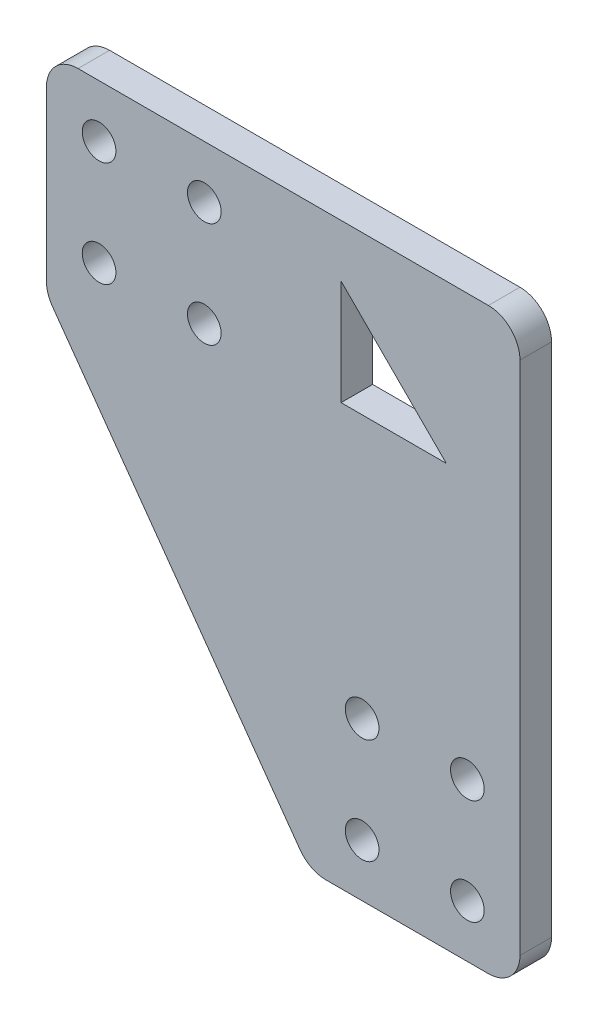
ISO-10303-21;
HEADER;
FILE_DESCRIPTION(('STEP AP214'),'2;1');
FILE_NAME('part.step','',(''),(''),'','','');
FILE_SCHEMA(('AUTOMOTIVE_DESIGN { 1 0 10303 214 1 1 1 1 }'));
ENDSEC;
DATA;
#1=APPLICATION_CONTEXT('core data for automotive mechanical design processes');
#2=APPLICATION_PROTOCOL_DEFINITION('international standard','automotive_design',2000,#1);
#3=PRODUCT_CONTEXT('',#1,'mechanical');
#4=PRODUCT('Part','Part','',(#3));
#5=PRODUCT_RELATED_PRODUCT_CATEGORY('part','',(#4));
#6=PRODUCT_DEFINITION_FORMATION('','',#4);
#7=PRODUCT_DEFINITION_CONTEXT('part definition',#1,'design');
#8=PRODUCT_DEFINITION('design','',#6,#7);
#9=PRODUCT_DEFINITION_SHAPE('','',#8);
#10=(LENGTH_UNIT() NAMED_UNIT(*) SI_UNIT(.MILLI.,.METRE.));
#11=(NAMED_UNIT(*) PLANE_ANGLE_UNIT() SI_UNIT($,.RADIAN.));
#12=(NAMED_UNIT(*) SI_UNIT($,.STERADIAN.) SOLID_ANGLE_UNIT());
#13=UNCERTAINTY_MEASURE_WITH_UNIT(LENGTH_MEASURE(1.E-05),#10,'distance_accuracy_value','');
#14=(GEOMETRIC_REPRESENTATION_CONTEXT(3) GLOBAL_UNCERTAINTY_ASSIGNED_CONTEXT((#13)) GLOBAL_UNIT_ASSIGNED_CONTEXT((#10,
#11,#12)) REPRESENTATION_CONTEXT('',''));
#15=CARTESIAN_POINT('',(0.,0.,0.));
#16=DIRECTION('',(0.,0.,1.));
#17=DIRECTION('',(1.,0.,0.));
#18=AXIS2_PLACEMENT_3D('',#15,#16,#17);
#19=CARTESIAN_POINT('',(0.,0.,3.));
#20=DIRECTION('',(0.,0.,-1.));
#21=DIRECTION('',(-1.,0.,0.));
#22=AXIS2_PLACEMENT_3D('',#19,#20,#21);
#23=PLANE('',#22);
#24=CARTESIAN_POINT('',(30.,-40.,3.));
#25=DIRECTION('',(0.,0.,1.));
#26=DIRECTION('',(-1.,0.,0.));
#27=AXIS2_PLACEMENT_3D('',#24,#25,#26);
#28=CIRCLE('',#27,1.6);
#29=CARTESIAN_POINT('',(28.4,-40.,3.));
#30=VERTEX_POINT('',#29);
#31=EDGE_CURVE('E182',#30,#30,#28,.T.);
#32=ORIENTED_EDGE('',*,*,#31,.F.);
#33=EDGE_LOOP('',(#32));
#34=FACE_BOUND('',#33,.T.);
#35=CARTESIAN_POINT('',(40.,-40.,3.));
#36=DIRECTION('',(0.,0.,1.));
#37=DIRECTION('',(1.,0.,0.));
#38=AXIS2_PLACEMENT_3D('',#35,#36,#37);
#39=CIRCLE('',#38,1.60000000000001);
#40=CARTESIAN_POINT('',(41.6,-40.,3.));
#41=VERTEX_POINT('',#40);
#42=EDGE_CURVE('E190',#41,#41,#39,.T.);
#43=ORIENTED_EDGE('',*,*,#42,.F.);
#44=EDGE_LOOP('',(#43));
#45=FACE_BOUND('',#44,.T.);
#46=CARTESIAN_POINT('',(40.,-50.,3.));
#47=DIRECTION('',(0.,0.,1.));
#48=DIRECTION('',(-1.,0.,0.));
#49=AXIS2_PLACEMENT_3D('',#46,#47,#48);
#50=CIRCLE('',#49,1.60000000000001);
#51=CARTESIAN_POINT('',(38.4,-50.,3.));
#52=VERTEX_POINT('',#51);
#53=EDGE_CURVE('E198',#52,#52,#50,.T.);
#54=ORIENTED_EDGE('',*,*,#53,.F.);
#55=EDGE_LOOP('',(#54));
#56=FACE_BOUND('',#55,.T.);
#57=CARTESIAN_POINT('',(30.,-50.,3.));
#58=DIRECTION('',(0.,0.,1.));
#59=DIRECTION('',(1.,0.,0.));
#60=AXIS2_PLACEMENT_3D('',#57,#58,#59);
#61=CIRCLE('',#60,1.6);
#62=CARTESIAN_POINT('',(31.6,-50.,3.));
#63=VERTEX_POINT('',#62);
#64=EDGE_CURVE('E206',#63,#63,#61,.T.);
#65=ORIENTED_EDGE('',*,*,#64,.F.);
#66=EDGE_LOOP('',(#65));
#67=FACE_BOUND('',#66,.T.);
#68=CARTESIAN_POINT('',(5.,-15.,3.));
#69=DIRECTION('',(0.,0.,1.));
#70=DIRECTION('',(-1.,0.,0.));
#71=AXIS2_PLACEMENT_3D('',#68,#69,#70);
#72=CIRCLE('',#71,1.6);
#73=CARTESIAN_POINT('',(3.4,-15.,3.));
#74=VERTEX_POINT('',#73);
#75=EDGE_CURVE('E214',#74,#74,#72,.T.);
#76=ORIENTED_EDGE('',*,*,#75,.F.);
#77=EDGE_LOOP('',(#76));
#78=FACE_BOUND('',#77,.T.);
#79=CARTESIAN_POINT('',(15.,-15.,3.));
#80=DIRECTION('',(0.,0.,1.));
#81=DIRECTION('',(1.,0.,0.));
#82=AXIS2_PLACEMENT_3D('',#79,#80,#81);
#83=CIRCLE('',#82,1.6);
#84=CARTESIAN_POINT('',(16.6,-15.,3.));
#85=VERTEX_POINT('',#84);
#86=EDGE_CURVE('E222',#85,#85,#83,.T.);
#87=ORIENTED_EDGE('',*,*,#86,.F.);
#88=EDGE_LOOP('',(#87));
#89=FACE_BOUND('',#88,.T.);
#90=CARTESIAN_POINT('',(15.,-5.,3.));
#91=DIRECTION('',(0.,0.,1.));
#92=DIRECTION('',(-1.,0.,0.));
#93=AXIS2_PLACEMENT_3D('',#90,#91,#92);
#94=CIRCLE('',#93,1.6);
#95=CARTESIAN_POINT('',(13.4,-5.,3.));
#96=VERTEX_POINT('',#95);
#97=EDGE_CURVE('E230',#96,#96,#94,.T.);
#98=ORIENTED_EDGE('',*,*,#97,.F.);
#99=EDGE_LOOP('',(#98));
#100=FACE_BOUND('',#99,.T.);
#101=CARTESIAN_POINT('',(5.,-5.,3.));
#102=DIRECTION('',(0.,0.,1.));
#103=DIRECTION('',(1.,0.,0.));
#104=AXIS2_PLACEMENT_3D('',#101,#102,#103);
#105=CIRCLE('',#104,1.6);
#106=CARTESIAN_POINT('',(6.6,-5.,3.));
#107=VERTEX_POINT('',#106);
#108=EDGE_CURVE('E238',#107,#107,#105,.T.);
#109=ORIENTED_EDGE('',*,*,#108,.F.);
#110=EDGE_LOOP('',(#109));
#111=FACE_BOUND('',#110,.T.);
#112=DIRECTION('',(0.581238193719096,-0.813733471206735,0.));
#113=VECTOR('',#112,1.);
#114=CARTESIAN_POINT('',(25.,-55.,3.));
#115=LINE('',#114,#113);
#116=CARTESIAN_POINT('',(0.558799586379798,-20.7823194209317,3.));
#117=VERTEX_POINT('',#116);
#118=CARTESIAN_POINT('',(24.1026532722552,-53.7437145811573,3.));
#119=VERTEX_POINT('',#118);
#120=EDGE_CURVE('E250',#117,#119,#115,.T.);
#121=ORIENTED_EDGE('',*,*,#120,.T.);
#122=CARTESIAN_POINT('',(26.5438536858754,-52.,3.));
#123=DIRECTION('',(0.,0.,-1.));
#124=DIRECTION('',(-1.,0.,0.));
#125=AXIS2_PLACEMENT_3D('',#122,#123,#124);
#126=CIRCLE('',#125,3.);
#127=CARTESIAN_POINT('',(26.5438536858754,-55.,3.));
#128=VERTEX_POINT('',#127);
#129=EDGE_CURVE('E322',#119,#128,#126,.F.);
#130=ORIENTED_EDGE('',*,*,#129,.T.);
#131=DIRECTION('',(1.,0.,0.));
#132=VECTOR('',#131,1.);
#133=CARTESIAN_POINT('',(45.,-55.,3.));
#134=LINE('',#133,#132);
#135=CARTESIAN_POINT('',(42.,-55.,3.));
#136=VERTEX_POINT('',#135);
#137=EDGE_CURVE('E255',#128,#136,#134,.T.);
#138=ORIENTED_EDGE('',*,*,#137,.T.);
#139=CARTESIAN_POINT('',(42.,-52.,3.));
#140=DIRECTION('',(0.,0.,-1.));
#141=DIRECTION('',(-1.,0.,0.));
#142=AXIS2_PLACEMENT_3D('',#139,#140,#141);
#143=CIRCLE('',#142,3.);
#144=CARTESIAN_POINT('',(45.,-52.,3.));
#145=VERTEX_POINT('',#144);
#146=EDGE_CURVE('E319',#136,#145,#143,.F.);
#147=ORIENTED_EDGE('',*,*,#146,.T.);
#148=DIRECTION('',(0.,1.,0.));
#149=VECTOR('',#148,1.);
#150=CARTESIAN_POINT('',(45.,0.,3.));
#151=LINE('',#150,#149);
#152=CARTESIAN_POINT('',(45.,-3.,3.));
#153=VERTEX_POINT('',#152);
#154=EDGE_CURVE('E259',#145,#153,#151,.T.);
#155=ORIENTED_EDGE('',*,*,#154,.T.);
#156=CARTESIAN_POINT('',(42.,-3.,3.));
#157=DIRECTION('',(0.,0.,-1.));
#158=DIRECTION('',(-1.,0.,0.));
#159=AXIS2_PLACEMENT_3D('',#156,#157,#158);
#160=CIRCLE('',#159,3.);
#161=CARTESIAN_POINT('',(42.,0.,3.));
#162=VERTEX_POINT('',#161);
#163=EDGE_CURVE('E66',#153,#162,#160,.F.);
#164=ORIENTED_EDGE('',*,*,#163,.T.);
#165=DIRECTION('',(-1.,0.,0.));
#166=VECTOR('',#165,1.);
#167=CARTESIAN_POINT('',(0.,0.,3.));
#168=LINE('',#167,#166);
#169=CARTESIAN_POINT('',(3.,0.,3.));
#170=VERTEX_POINT('',#169);
#171=EDGE_CURVE('E262',#162,#170,#168,.T.);
#172=ORIENTED_EDGE('',*,*,#171,.T.);
#173=CARTESIAN_POINT('',(3.,-3.,3.));
#174=DIRECTION('',(0.,0.,-1.));
#175=DIRECTION('',(-1.,0.,0.));
#176=AXIS2_PLACEMENT_3D('',#173,#174,#175);
#177=CIRCLE('',#176,3.);
#178=CARTESIAN_POINT('',(0.,-3.,3.));
#179=VERTEX_POINT('',#178);
#180=EDGE_CURVE('E311',#170,#179,#177,.F.);
#181=ORIENTED_EDGE('',*,*,#180,.T.);
#182=DIRECTION('',(0.,-1.,0.));
#183=VECTOR('',#182,1.);
#184=CARTESIAN_POINT('',(0.,-20.,3.));
#185=LINE('',#184,#183);
#186=CARTESIAN_POINT('',(0.,-19.0386048397744,3.));
#187=VERTEX_POINT('',#186);
#188=EDGE_CURVE('E246',#179,#187,#185,.T.);
#189=ORIENTED_EDGE('',*,*,#188,.T.);
#190=CARTESIAN_POINT('',(3.,-19.0386048397744,3.));
#191=DIRECTION('',(0.,0.,-1.));
#192=DIRECTION('',(-1.,0.,0.));
#193=AXIS2_PLACEMENT_3D('',#190,#191,#192);
#194=CIRCLE('',#193,3.);
#195=EDGE_CURVE('E314',#187,#117,#194,.F.);
#196=ORIENTED_EDGE('',*,*,#195,.T.);
#197=EDGE_LOOP('',(#121,#130,#138,#147,#155,#164,#172,#181,#189,#196));
#198=FACE_BOUND('',#197,.T.);
#199=DIRECTION('',(-0.707106781186548,0.707106781186547,0.));
#200=VECTOR('',#199,1.);
#201=CARTESIAN_POINT('',(38.,-15.,3.));
#202=LINE('',#201,#200);
#203=CARTESIAN_POINT('',(38.,-15.,3.));
#204=VERTEX_POINT('',#203);
#205=CARTESIAN_POINT('',(28.,-5.,3.));
#206=VERTEX_POINT('',#205);
#207=EDGE_CURVE('E141',#204,#206,#202,.T.);
#208=ORIENTED_EDGE('',*,*,#207,.F.);
#209=DIRECTION('',(1.,0.,0.));
#210=VECTOR('',#209,1.);
#211=CARTESIAN_POINT('',(28.,-15.,3.));
#212=LINE('',#211,#210);
#213=CARTESIAN_POINT('',(28.,-15.,3.));
#214=VERTEX_POINT('',#213);
#215=EDGE_CURVE('E164',#214,#204,#212,.T.);
#216=ORIENTED_EDGE('',*,*,#215,.F.);
#217=DIRECTION('',(0.,-1.,0.));
#218=VECTOR('',#217,1.);
#219=CARTESIAN_POINT('',(28.,-5.,3.));
#220=LINE('',#219,#218);
#221=EDGE_CURVE('E152',#206,#214,#220,.T.);
#222=ORIENTED_EDGE('',*,*,#221,.F.);
#223=EDGE_LOOP('',(#208,#216,#222));
#224=FACE_BOUND('',#223,.T.);
#225=ADVANCED_FACE('F43',(#34,#45,#56,#67,#78,#89,#100,#111,#198,#224),#23,.F.);
#226=CARTESIAN_POINT('',(0.,0.,0.));
#227=DIRECTION('',(0.,0.,-1.));
#228=DIRECTION('',(-1.,0.,0.));
#229=AXIS2_PLACEMENT_3D('',#226,#227,#228);
#230=PLANE('',#229);
#231=CARTESIAN_POINT('',(40.,-40.,0.));
#232=DIRECTION('',(0.,0.,1.));
#233=DIRECTION('',(1.,0.,0.));
#234=AXIS2_PLACEMENT_3D('',#231,#232,#233);
#235=CIRCLE('',#234,1.60000000000001);
#236=CARTESIAN_POINT('',(41.6,-40.,0.));
#237=VERTEX_POINT('',#236);
#238=EDGE_CURVE('E186',#237,#237,#235,.T.);
#239=ORIENTED_EDGE('',*,*,#238,.T.);
#240=EDGE_LOOP('',(#239));
#241=FACE_BOUND('',#240,.T.);
#242=CARTESIAN_POINT('',(30.,-50.,0.));
#243=DIRECTION('',(0.,0.,1.));
#244=DIRECTION('',(1.,0.,0.));
#245=AXIS2_PLACEMENT_3D('',#242,#243,#244);
#246=CIRCLE('',#245,1.6);
#247=CARTESIAN_POINT('',(31.6,-50.,0.));
#248=VERTEX_POINT('',#247);
#249=EDGE_CURVE('E202',#248,#248,#246,.T.);
#250=ORIENTED_EDGE('',*,*,#249,.T.);
#251=EDGE_LOOP('',(#250));
#252=FACE_BOUND('',#251,.T.);
#253=CARTESIAN_POINT('',(15.,-15.,0.));
#254=DIRECTION('',(0.,0.,1.));
#255=DIRECTION('',(1.,0.,0.));
#256=AXIS2_PLACEMENT_3D('',#253,#254,#255);
#257=CIRCLE('',#256,1.6);
#258=CARTESIAN_POINT('',(16.6,-15.,0.));
#259=VERTEX_POINT('',#258);
#260=EDGE_CURVE('E218',#259,#259,#257,.T.);
#261=ORIENTED_EDGE('',*,*,#260,.T.);
#262=EDGE_LOOP('',(#261));
#263=FACE_BOUND('',#262,.T.);
#264=CARTESIAN_POINT('',(5.,-5.,0.));
#265=DIRECTION('',(0.,0.,1.));
#266=DIRECTION('',(1.,0.,0.));
#267=AXIS2_PLACEMENT_3D('',#264,#265,#266);
#268=CIRCLE('',#267,1.6);
#269=CARTESIAN_POINT('',(6.6,-5.,0.));
#270=VERTEX_POINT('',#269);
#271=EDGE_CURVE('E234',#270,#270,#268,.T.);
#272=ORIENTED_EDGE('',*,*,#271,.T.);
#273=EDGE_LOOP('',(#272));
#274=FACE_BOUND('',#273,.T.);
#275=DIRECTION('',(1.,0.,0.));
#276=VECTOR('',#275,1.);
#277=CARTESIAN_POINT('',(45.,-55.,0.));
#278=LINE('',#277,#276);
#279=CARTESIAN_POINT('',(26.5438536858754,-55.,0.));
#280=VERTEX_POINT('',#279);
#281=CARTESIAN_POINT('',(42.,-55.,0.));
#282=VERTEX_POINT('',#281);
#283=EDGE_CURVE('E273',#280,#282,#278,.T.);
#284=ORIENTED_EDGE('',*,*,#283,.F.);
#285=CARTESIAN_POINT('',(26.5438536858754,-52.,0.));
#286=DIRECTION('',(0.,0.,-1.));
#287=DIRECTION('',(-1.,0.,0.));
#288=AXIS2_PLACEMENT_3D('',#285,#286,#287);
#289=CIRCLE('',#288,3.);
#290=CARTESIAN_POINT('',(24.1026532722552,-53.7437145811573,0.));
#291=VERTEX_POINT('',#290);
#292=EDGE_CURVE('E301',#280,#291,#289,.T.);
#293=ORIENTED_EDGE('',*,*,#292,.T.);
#294=DIRECTION('',(0.581238193719096,-0.813733471206735,0.));
#295=VECTOR('',#294,1.);
#296=CARTESIAN_POINT('',(25.,-55.,0.));
#297=LINE('',#296,#295);
#298=CARTESIAN_POINT('',(0.558799586379798,-20.7823194209317,0.));
#299=VERTEX_POINT('',#298);
#300=EDGE_CURVE('E269',#299,#291,#297,.T.);
#301=ORIENTED_EDGE('',*,*,#300,.F.);
#302=CARTESIAN_POINT('',(3.,-19.0386048397744,0.));
#303=DIRECTION('',(0.,0.,-1.));
#304=DIRECTION('',(-1.,0.,0.));
#305=AXIS2_PLACEMENT_3D('',#302,#303,#304);
#306=CIRCLE('',#305,3.);
#307=CARTESIAN_POINT('',(0.,-19.0386048397744,0.));
#308=VERTEX_POINT('',#307);
#309=EDGE_CURVE('E292',#299,#308,#306,.T.);
#310=ORIENTED_EDGE('',*,*,#309,.T.);
#311=DIRECTION('',(0.,-1.,0.));
#312=VECTOR('',#311,1.);
#313=CARTESIAN_POINT('',(0.,-20.,0.));
#314=LINE('',#313,#312);
#315=CARTESIAN_POINT('',(0.,-3.,0.));
#316=VERTEX_POINT('',#315);
#317=EDGE_CURVE('E242',#316,#308,#314,.T.);
#318=ORIENTED_EDGE('',*,*,#317,.F.);
#319=CARTESIAN_POINT('',(3.,-3.,0.));
#320=DIRECTION('',(0.,0.,-1.));
#321=DIRECTION('',(-1.,0.,0.));
#322=AXIS2_PLACEMENT_3D('',#319,#320,#321);
#323=CIRCLE('',#322,3.);
#324=CARTESIAN_POINT('',(3.,0.,0.));
#325=VERTEX_POINT('',#324);
#326=EDGE_CURVE('E289',#316,#325,#323,.T.);
#327=ORIENTED_EDGE('',*,*,#326,.T.);
#328=DIRECTION('',(-1.,0.,0.));
#329=VECTOR('',#328,1.);
#330=CARTESIAN_POINT('',(0.,0.,0.));
#331=LINE('',#330,#329);
#332=CARTESIAN_POINT('',(42.,0.,0.));
#333=VERTEX_POINT('',#332);
#334=EDGE_CURVE('E251',#333,#325,#331,.T.);
#335=ORIENTED_EDGE('',*,*,#334,.F.);
#336=CARTESIAN_POINT('',(42.,-3.,0.));
#337=DIRECTION('',(0.,0.,-1.));
#338=DIRECTION('',(-1.,0.,0.));
#339=AXIS2_PLACEMENT_3D('',#336,#337,#338);
#340=CIRCLE('',#339,3.);
#341=CARTESIAN_POINT('',(45.,-3.,0.));
#342=VERTEX_POINT('',#341);
#343=EDGE_CURVE('E295',#333,#342,#340,.T.);
#344=ORIENTED_EDGE('',*,*,#343,.T.);
#345=DIRECTION('',(0.,1.,0.));
#346=VECTOR('',#345,1.);
#347=CARTESIAN_POINT('',(45.,0.,0.));
#348=LINE('',#347,#346);
#349=CARTESIAN_POINT('',(45.,-52.,0.));
#350=VERTEX_POINT('',#349);
#351=EDGE_CURVE('E277',#350,#342,#348,.T.);
#352=ORIENTED_EDGE('',*,*,#351,.F.);
#353=CARTESIAN_POINT('',(42.,-52.,0.));
#354=DIRECTION('',(0.,0.,-1.));
#355=DIRECTION('',(-1.,0.,0.));
#356=AXIS2_PLACEMENT_3D('',#353,#354,#355);
#357=CIRCLE('',#356,3.);
#358=EDGE_CURVE('E298',#350,#282,#357,.T.);
#359=ORIENTED_EDGE('',*,*,#358,.T.);
#360=EDGE_LOOP('',(#284,#293,#301,#310,#318,#327,#335,#344,#352,#359));
#361=FACE_BOUND('',#360,.T.);
#362=CARTESIAN_POINT('',(15.,-5.,0.));
#363=DIRECTION('',(0.,0.,1.));
#364=DIRECTION('',(-1.,0.,0.));
#365=AXIS2_PLACEMENT_3D('',#362,#363,#364);
#366=CIRCLE('',#365,1.6);
#367=CARTESIAN_POINT('',(13.4,-5.,0.));
#368=VERTEX_POINT('',#367);
#369=EDGE_CURVE('E226',#368,#368,#366,.T.);
#370=ORIENTED_EDGE('',*,*,#369,.T.);
#371=EDGE_LOOP('',(#370));
#372=FACE_BOUND('',#371,.T.);
#373=CARTESIAN_POINT('',(5.,-15.,0.));
#374=DIRECTION('',(0.,0.,1.));
#375=DIRECTION('',(-1.,0.,0.));
#376=AXIS2_PLACEMENT_3D('',#373,#374,#375);
#377=CIRCLE('',#376,1.6);
#378=CARTESIAN_POINT('',(3.4,-15.,0.));
#379=VERTEX_POINT('',#378);
#380=EDGE_CURVE('E210',#379,#379,#377,.T.);
#381=ORIENTED_EDGE('',*,*,#380,.T.);
#382=EDGE_LOOP('',(#381));
#383=FACE_BOUND('',#382,.T.);
#384=CARTESIAN_POINT('',(40.,-50.,0.));
#385=DIRECTION('',(0.,0.,1.));
#386=DIRECTION('',(-1.,0.,0.));
#387=AXIS2_PLACEMENT_3D('',#384,#385,#386);
#388=CIRCLE('',#387,1.60000000000001);
#389=CARTESIAN_POINT('',(38.4,-50.,0.));
#390=VERTEX_POINT('',#389);
#391=EDGE_CURVE('E194',#390,#390,#388,.T.);
#392=ORIENTED_EDGE('',*,*,#391,.T.);
#393=EDGE_LOOP('',(#392));
#394=FACE_BOUND('',#393,.T.);
#395=CARTESIAN_POINT('',(30.,-40.,0.));
#396=DIRECTION('',(0.,0.,1.));
#397=DIRECTION('',(-1.,0.,0.));
#398=AXIS2_PLACEMENT_3D('',#395,#396,#397);
#399=CIRCLE('',#398,1.6);
#400=CARTESIAN_POINT('',(28.4,-40.,0.));
#401=VERTEX_POINT('',#400);
#402=EDGE_CURVE('E161',#401,#401,#399,.T.);
#403=ORIENTED_EDGE('',*,*,#402,.T.);
#404=EDGE_LOOP('',(#403));
#405=FACE_BOUND('',#404,.T.);
#406=DIRECTION('',(1.,0.,0.));
#407=VECTOR('',#406,1.);
#408=CARTESIAN_POINT('',(28.,-15.,0.));
#409=LINE('',#408,#407);
#410=CARTESIAN_POINT('',(28.,-15.,0.));
#411=VERTEX_POINT('',#410);
#412=CARTESIAN_POINT('',(38.,-15.,0.));
#413=VERTEX_POINT('',#412);
#414=EDGE_CURVE('E153',#411,#413,#409,.T.);
#415=ORIENTED_EDGE('',*,*,#414,.T.);
#416=DIRECTION('',(-0.707106781186548,0.707106781186547,0.));
#417=VECTOR('',#416,1.);
#418=CARTESIAN_POINT('',(38.,-15.,0.));
#419=LINE('',#418,#417);
#420=CARTESIAN_POINT('',(28.,-5.,0.));
#421=VERTEX_POINT('',#420);
#422=EDGE_CURVE('E170',#413,#421,#419,.T.);
#423=ORIENTED_EDGE('',*,*,#422,.T.);
#424=DIRECTION('',(0.,-1.,0.));
#425=VECTOR('',#424,1.);
#426=CARTESIAN_POINT('',(28.,-5.,0.));
#427=LINE('',#426,#425);
#428=EDGE_CURVE('E159',#421,#411,#427,.T.);
#429=ORIENTED_EDGE('',*,*,#428,.T.);
#430=EDGE_LOOP('',(#415,#423,#429));
#431=FACE_BOUND('',#430,.T.);
#432=ADVANCED_FACE('F349',(#241,#252,#263,#274,#361,#372,#383,#394,#405,#431),#230,.T.);
#433=CARTESIAN_POINT('',(0.,-20.,3.));
#434=DIRECTION('',(1.,0.,0.));
#435=DIRECTION('',(0.,0.,-1.));
#436=AXIS2_PLACEMENT_3D('',#433,#434,#435);
#437=PLANE('',#436);
#438=ORIENTED_EDGE('',*,*,#317,.T.);
#439=DIRECTION('',(0.,0.,-1.));
#440=VECTOR('',#439,1.);
#441=CARTESIAN_POINT('',(0.,-19.0386048397744,3.));
#442=LINE('',#441,#440);
#443=EDGE_CURVE('E11',#308,#187,#442,.F.);
#444=ORIENTED_EDGE('',*,*,#443,.T.);
#445=ORIENTED_EDGE('',*,*,#188,.F.);
#446=DIRECTION('',(0.,0.,-1.));
#447=VECTOR('',#446,1.);
#448=CARTESIAN_POINT('',(0.,-3.,3.));
#449=LINE('',#448,#447);
#450=EDGE_CURVE('E52',#179,#316,#449,.T.);
#451=ORIENTED_EDGE('',*,*,#450,.T.);
#452=EDGE_LOOP('',(#438,#444,#445,#451));
#453=FACE_BOUND('',#452,.T.);
#454=ADVANCED_FACE('F343',(#453),#437,.F.);
#455=CARTESIAN_POINT('',(25.,-55.,3.));
#456=DIRECTION('',(0.813733471206735,0.581238193719096,0.));
#457=DIRECTION('',(-0.581238193719096,0.813733471206735,0.));
#458=AXIS2_PLACEMENT_3D('',#455,#456,#457);
#459=PLANE('',#458);
#460=ORIENTED_EDGE('',*,*,#300,.T.);
#461=DIRECTION('',(0.,0.,-1.));
#462=VECTOR('',#461,1.);
#463=CARTESIAN_POINT('',(24.1026532722552,-53.7437145811573,3.));
#464=LINE('',#463,#462);
#465=EDGE_CURVE('E308',#291,#119,#464,.F.);
#466=ORIENTED_EDGE('',*,*,#465,.T.);
#467=ORIENTED_EDGE('',*,*,#120,.F.);
#468=DIRECTION('',(0.,0.,-1.));
#469=VECTOR('',#468,1.);
#470=CARTESIAN_POINT('',(0.558799586379787,-20.7823194209317,3.));
#471=LINE('',#470,#469);
#472=EDGE_CURVE('E304',#117,#299,#471,.T.);
#473=ORIENTED_EDGE('',*,*,#472,.T.);
#474=EDGE_LOOP('',(#460,#466,#467,#473));
#475=FACE_BOUND('',#474,.T.);
#476=ADVANCED_FACE('F359',(#475),#459,.F.);
#477=CARTESIAN_POINT('',(45.,-55.,3.));
#478=DIRECTION('',(0.,1.,0.));
#479=DIRECTION('',(-1.,0.,0.));
#480=AXIS2_PLACEMENT_3D('',#477,#478,#479);
#481=PLANE('',#480);
#482=ORIENTED_EDGE('',*,*,#137,.F.);
#483=DIRECTION('',(0.,0.,-1.));
#484=VECTOR('',#483,1.);
#485=CARTESIAN_POINT('',(26.5438536858754,-55.,3.));
#486=LINE('',#485,#484);
#487=EDGE_CURVE('E285',#128,#280,#486,.T.);
#488=ORIENTED_EDGE('',*,*,#487,.T.);
#489=ORIENTED_EDGE('',*,*,#283,.T.);
#490=DIRECTION('',(0.,0.,-1.));
#491=VECTOR('',#490,1.);
#492=CARTESIAN_POINT('',(42.,-55.,3.));
#493=LINE('',#492,#491);
#494=EDGE_CURVE('E265',#282,#136,#493,.F.);
#495=ORIENTED_EDGE('',*,*,#494,.T.);
#496=EDGE_LOOP('',(#482,#488,#489,#495));
#497=FACE_BOUND('',#496,.T.);
#498=ADVANCED_FACE('F367',(#497),#481,.F.);
#499=CARTESIAN_POINT('',(45.,0.,3.));
#500=DIRECTION('',(-1.,0.,0.));
#501=DIRECTION('',(0.,-1.,0.));
#502=AXIS2_PLACEMENT_3D('',#499,#500,#501);
#503=PLANE('',#502);
#504=ORIENTED_EDGE('',*,*,#154,.F.);
#505=DIRECTION('',(0.,0.,-1.));
#506=VECTOR('',#505,1.);
#507=CARTESIAN_POINT('',(45.,-52.,3.));
#508=LINE('',#507,#506);
#509=EDGE_CURVE('E328',#145,#350,#508,.T.);
#510=ORIENTED_EDGE('',*,*,#509,.T.);
#511=ORIENTED_EDGE('',*,*,#351,.T.);
#512=DIRECTION('',(0.,0.,-1.));
#513=VECTOR('',#512,1.);
#514=CARTESIAN_POINT('',(45.,-3.,3.));
#515=LINE('',#514,#513);
#516=EDGE_CURVE('E325',#342,#153,#515,.F.);
#517=ORIENTED_EDGE('',*,*,#516,.T.);
#518=EDGE_LOOP('',(#504,#510,#511,#517));
#519=FACE_BOUND('',#518,.T.);
#520=ADVANCED_FACE('F376',(#519),#503,.F.);
#521=CARTESIAN_POINT('',(0.,0.,3.));
#522=DIRECTION('',(0.,-1.,0.));
#523=DIRECTION('',(0.,0.,-1.));
#524=AXIS2_PLACEMENT_3D('',#521,#522,#523);
#525=PLANE('',#524);
#526=ORIENTED_EDGE('',*,*,#171,.F.);
#527=DIRECTION('',(0.,0.,-1.));
#528=VECTOR('',#527,1.);
#529=CARTESIAN_POINT('',(42.,0.,3.));
#530=LINE('',#529,#528);
#531=EDGE_CURVE('E334',#162,#333,#530,.T.);
#532=ORIENTED_EDGE('',*,*,#531,.T.);
#533=ORIENTED_EDGE('',*,*,#334,.T.);
#534=DIRECTION('',(0.,0.,-1.));
#535=VECTOR('',#534,1.);
#536=CARTESIAN_POINT('',(3.,0.,3.));
#537=LINE('',#536,#535);
#538=EDGE_CURVE('E59',#325,#170,#537,.F.);
#539=ORIENTED_EDGE('',*,*,#538,.T.);
#540=EDGE_LOOP('',(#526,#532,#533,#539));
#541=FACE_BOUND('',#540,.T.);
#542=ADVANCED_FACE('F381',(#541),#525,.F.);
#543=CARTESIAN_POINT('',(5.,-5.,3.));
#544=DIRECTION('',(0.,0.,-1.));
#545=DIRECTION('',(-1.,0.,0.));
#546=AXIS2_PLACEMENT_3D('',#543,#544,#545);
#547=CYLINDRICAL_SURFACE('',#546,1.6);
#548=ORIENTED_EDGE('',*,*,#108,.T.);
#549=EDGE_LOOP('',(#548));
#550=FACE_BOUND('',#549,.T.);
#551=ORIENTED_EDGE('',*,*,#271,.F.);
#552=EDGE_LOOP('',(#551));
#553=FACE_BOUND('',#552,.T.);
#554=ADVANCED_FACE('F397',(#550,#553),#547,.F.);
#555=CARTESIAN_POINT('',(15.,-5.,3.));
#556=DIRECTION('',(0.,0.,-1.));
#557=DIRECTION('',(-1.,0.,0.));
#558=AXIS2_PLACEMENT_3D('',#555,#556,#557);
#559=CYLINDRICAL_SURFACE('',#558,1.6);
#560=ORIENTED_EDGE('',*,*,#97,.T.);
#561=EDGE_LOOP('',(#560));
#562=FACE_BOUND('',#561,.T.);
#563=ORIENTED_EDGE('',*,*,#369,.F.);
#564=EDGE_LOOP('',(#563));
#565=FACE_BOUND('',#564,.T.);
#566=ADVANCED_FACE('F532',(#562,#565),#559,.F.);
#567=CARTESIAN_POINT('',(15.,-15.,3.));
#568=DIRECTION('',(0.,0.,-1.));
#569=DIRECTION('',(-1.,0.,0.));
#570=AXIS2_PLACEMENT_3D('',#567,#568,#569);
#571=CYLINDRICAL_SURFACE('',#570,1.6);
#572=ORIENTED_EDGE('',*,*,#86,.T.);
#573=EDGE_LOOP('',(#572));
#574=FACE_BOUND('',#573,.T.);
#575=ORIENTED_EDGE('',*,*,#260,.F.);
#576=EDGE_LOOP('',(#575));
#577=FACE_BOUND('',#576,.T.);
#578=ADVANCED_FACE('F522',(#574,#577),#571,.F.);
#579=CARTESIAN_POINT('',(5.,-15.,3.));
#580=DIRECTION('',(0.,0.,-1.));
#581=DIRECTION('',(-1.,0.,0.));
#582=AXIS2_PLACEMENT_3D('',#579,#580,#581);
#583=CYLINDRICAL_SURFACE('',#582,1.6);
#584=ORIENTED_EDGE('',*,*,#75,.T.);
#585=EDGE_LOOP('',(#584));
#586=FACE_BOUND('',#585,.T.);
#587=ORIENTED_EDGE('',*,*,#380,.F.);
#588=EDGE_LOOP('',(#587));
#589=FACE_BOUND('',#588,.T.);
#590=ADVANCED_FACE('F512',(#586,#589),#583,.F.);
#591=CARTESIAN_POINT('',(30.,-50.,3.));
#592=DIRECTION('',(0.,0.,-1.));
#593=DIRECTION('',(-1.,0.,0.));
#594=AXIS2_PLACEMENT_3D('',#591,#592,#593);
#595=CYLINDRICAL_SURFACE('',#594,1.6);
#596=ORIENTED_EDGE('',*,*,#64,.T.);
#597=EDGE_LOOP('',(#596));
#598=FACE_BOUND('',#597,.T.);
#599=ORIENTED_EDGE('',*,*,#249,.F.);
#600=EDGE_LOOP('',(#599));
#601=FACE_BOUND('',#600,.T.);
#602=ADVANCED_FACE('F502',(#598,#601),#595,.F.);
#603=CARTESIAN_POINT('',(40.,-50.,3.));
#604=DIRECTION('',(0.,0.,-1.));
#605=DIRECTION('',(-1.,0.,0.));
#606=AXIS2_PLACEMENT_3D('',#603,#604,#605);
#607=CYLINDRICAL_SURFACE('',#606,1.60000000000001);
#608=ORIENTED_EDGE('',*,*,#53,.T.);
#609=EDGE_LOOP('',(#608));
#610=FACE_BOUND('',#609,.T.);
#611=ORIENTED_EDGE('',*,*,#391,.F.);
#612=EDGE_LOOP('',(#611));
#613=FACE_BOUND('',#612,.T.);
#614=ADVANCED_FACE('F492',(#610,#613),#607,.F.);
#615=CARTESIAN_POINT('',(40.,-40.,3.));
#616=DIRECTION('',(0.,0.,-1.));
#617=DIRECTION('',(-1.,0.,0.));
#618=AXIS2_PLACEMENT_3D('',#615,#616,#617);
#619=CYLINDRICAL_SURFACE('',#618,1.60000000000001);
#620=ORIENTED_EDGE('',*,*,#42,.T.);
#621=EDGE_LOOP('',(#620));
#622=FACE_BOUND('',#621,.T.);
#623=ORIENTED_EDGE('',*,*,#238,.F.);
#624=EDGE_LOOP('',(#623));
#625=FACE_BOUND('',#624,.T.);
#626=ADVANCED_FACE('F482',(#622,#625),#619,.F.);
#627=CARTESIAN_POINT('',(30.,-40.,3.));
#628=DIRECTION('',(0.,0.,-1.));
#629=DIRECTION('',(-1.,0.,0.));
#630=AXIS2_PLACEMENT_3D('',#627,#628,#629);
#631=CYLINDRICAL_SURFACE('',#630,1.6);
#632=ORIENTED_EDGE('',*,*,#31,.T.);
#633=EDGE_LOOP('',(#632));
#634=FACE_BOUND('',#633,.T.);
#635=ORIENTED_EDGE('',*,*,#402,.F.);
#636=EDGE_LOOP('',(#635));
#637=FACE_BOUND('',#636,.T.);
#638=ADVANCED_FACE('F473',(#634,#637),#631,.F.);
#639=CARTESIAN_POINT('',(38.,-15.,3.));
#640=DIRECTION('',(-0.707106781186547,-0.707106781186548,0.));
#641=DIRECTION('',(0.707106781186548,-0.707106781186547,0.));
#642=AXIS2_PLACEMENT_3D('',#639,#640,#641);
#643=PLANE('',#642);
#644=ORIENTED_EDGE('',*,*,#422,.F.);
#645=DIRECTION('',(0.,0.,-1.));
#646=VECTOR('',#645,1.);
#647=CARTESIAN_POINT('',(38.,-15.,3.));
#648=LINE('',#647,#646);
#649=EDGE_CURVE('E147',#204,#413,#648,.T.);
#650=ORIENTED_EDGE('',*,*,#649,.F.);
#651=ORIENTED_EDGE('',*,*,#207,.T.);
#652=DIRECTION('',(0.,0.,-1.));
#653=VECTOR('',#652,1.);
#654=CARTESIAN_POINT('',(28.,-5.,3.));
#655=LINE('',#654,#653);
#656=EDGE_CURVE('E144',#206,#421,#655,.T.);
#657=ORIENTED_EDGE('',*,*,#656,.T.);
#658=EDGE_LOOP('',(#644,#650,#651,#657));
#659=FACE_BOUND('',#658,.T.);
#660=ADVANCED_FACE('F143',(#659),#643,.T.);
#661=CARTESIAN_POINT('',(28.,-5.,3.));
#662=DIRECTION('',(1.,0.,0.));
#663=DIRECTION('',(0.,0.,-1.));
#664=AXIS2_PLACEMENT_3D('',#661,#662,#663);
#665=PLANE('',#664);
#666=ORIENTED_EDGE('',*,*,#428,.F.);
#667=ORIENTED_EDGE('',*,*,#656,.F.);
#668=ORIENTED_EDGE('',*,*,#221,.T.);
#669=DIRECTION('',(0.,0.,-1.));
#670=VECTOR('',#669,1.);
#671=CARTESIAN_POINT('',(28.,-15.,3.));
#672=LINE('',#671,#670);
#673=EDGE_CURVE('E162',#214,#411,#672,.T.);
#674=ORIENTED_EDGE('',*,*,#673,.T.);
#675=EDGE_LOOP('',(#666,#667,#668,#674));
#676=FACE_BOUND('',#675,.T.);
#677=ADVANCED_FACE('F157',(#676),#665,.T.);
#678=CARTESIAN_POINT('',(28.,-15.,3.));
#679=DIRECTION('',(0.,1.,0.));
#680=DIRECTION('',(0.,0.,1.));
#681=AXIS2_PLACEMENT_3D('',#678,#679,#680);
#682=PLANE('',#681);
#683=ORIENTED_EDGE('',*,*,#414,.F.);
#684=ORIENTED_EDGE('',*,*,#673,.F.);
#685=ORIENTED_EDGE('',*,*,#215,.T.);
#686=ORIENTED_EDGE('',*,*,#649,.T.);
#687=EDGE_LOOP('',(#683,#684,#685,#686));
#688=FACE_BOUND('',#687,.T.);
#689=ADVANCED_FACE('F412',(#688),#682,.T.);
#690=CARTESIAN_POINT('',(26.5438536858754,-52.,3.));
#691=DIRECTION('',(0.,0.,-1.));
#692=DIRECTION('',(-1.,0.,0.));
#693=AXIS2_PLACEMENT_3D('',#690,#691,#692);
#694=CYLINDRICAL_SURFACE('',#693,3.);
#695=ORIENTED_EDGE('',*,*,#129,.F.);
#696=ORIENTED_EDGE('',*,*,#465,.F.);
#697=ORIENTED_EDGE('',*,*,#292,.F.);
#698=ORIENTED_EDGE('',*,*,#487,.F.);
#699=EDGE_LOOP('',(#695,#696,#697,#698));
#700=FACE_BOUND('',#699,.T.);
#701=ADVANCED_FACE('F365',(#700),#694,.T.);
#702=CARTESIAN_POINT('',(42.,-52.,3.));
#703=DIRECTION('',(0.,0.,-1.));
#704=DIRECTION('',(-1.,0.,0.));
#705=AXIS2_PLACEMENT_3D('',#702,#703,#704);
#706=CYLINDRICAL_SURFACE('',#705,3.);
#707=ORIENTED_EDGE('',*,*,#146,.F.);
#708=ORIENTED_EDGE('',*,*,#494,.F.);
#709=ORIENTED_EDGE('',*,*,#358,.F.);
#710=ORIENTED_EDGE('',*,*,#509,.F.);
#711=EDGE_LOOP('',(#707,#708,#709,#710));
#712=FACE_BOUND('',#711,.T.);
#713=ADVANCED_FACE('F373',(#712),#706,.T.);
#714=CARTESIAN_POINT('',(42.,-3.,3.));
#715=DIRECTION('',(0.,0.,-1.));
#716=DIRECTION('',(-1.,0.,0.));
#717=AXIS2_PLACEMENT_3D('',#714,#715,#716);
#718=CYLINDRICAL_SURFACE('',#717,3.);
#719=ORIENTED_EDGE('',*,*,#163,.F.);
#720=ORIENTED_EDGE('',*,*,#516,.F.);
#721=ORIENTED_EDGE('',*,*,#343,.F.);
#722=ORIENTED_EDGE('',*,*,#531,.F.);
#723=EDGE_LOOP('',(#719,#720,#721,#722));
#724=FACE_BOUND('',#723,.T.);
#725=ADVANCED_FACE('F380',(#724),#718,.T.);
#726=CARTESIAN_POINT('',(3.,-19.0386048397744,3.));
#727=DIRECTION('',(0.,0.,-1.));
#728=DIRECTION('',(-1.,0.,0.));
#729=AXIS2_PLACEMENT_3D('',#726,#727,#728);
#730=CYLINDRICAL_SURFACE('',#729,3.);
#731=ORIENTED_EDGE('',*,*,#195,.F.);
#732=ORIENTED_EDGE('',*,*,#443,.F.);
#733=ORIENTED_EDGE('',*,*,#309,.F.);
#734=ORIENTED_EDGE('',*,*,#472,.F.);
#735=EDGE_LOOP('',(#731,#732,#733,#734));
#736=FACE_BOUND('',#735,.T.);
#737=ADVANCED_FACE('F356',(#736),#730,.T.);
#738=CARTESIAN_POINT('',(3.,-3.,3.));
#739=DIRECTION('',(0.,0.,-1.));
#740=DIRECTION('',(-1.,0.,0.));
#741=AXIS2_PLACEMENT_3D('',#738,#739,#740);
#742=CYLINDRICAL_SURFACE('',#741,3.);
#743=ORIENTED_EDGE('',*,*,#180,.F.);
#744=ORIENTED_EDGE('',*,*,#538,.F.);
#745=ORIENTED_EDGE('',*,*,#326,.F.);
#746=ORIENTED_EDGE('',*,*,#450,.F.);
#747=EDGE_LOOP('',(#743,#744,#745,#746));
#748=FACE_BOUND('',#747,.T.);
#749=ADVANCED_FACE('F45',(#748),#742,.T.);
#750=CLOSED_SHELL('',(#225,#432,#454,#476,#498,#520,#542,#554,#566,#578,#590,#602,#614,#626,
#638,#660,#677,#689,#701,#713,#725,#737,#749));
#751=MANIFOLD_SOLID_BREP('B2',#750);
#752=ADVANCED_BREP_SHAPE_REPRESENTATION('',(#18,#751),#14);
#753=SHAPE_DEFINITION_REPRESENTATION(#9,#752);
ENDSEC;
END-ISO-10303-21;
